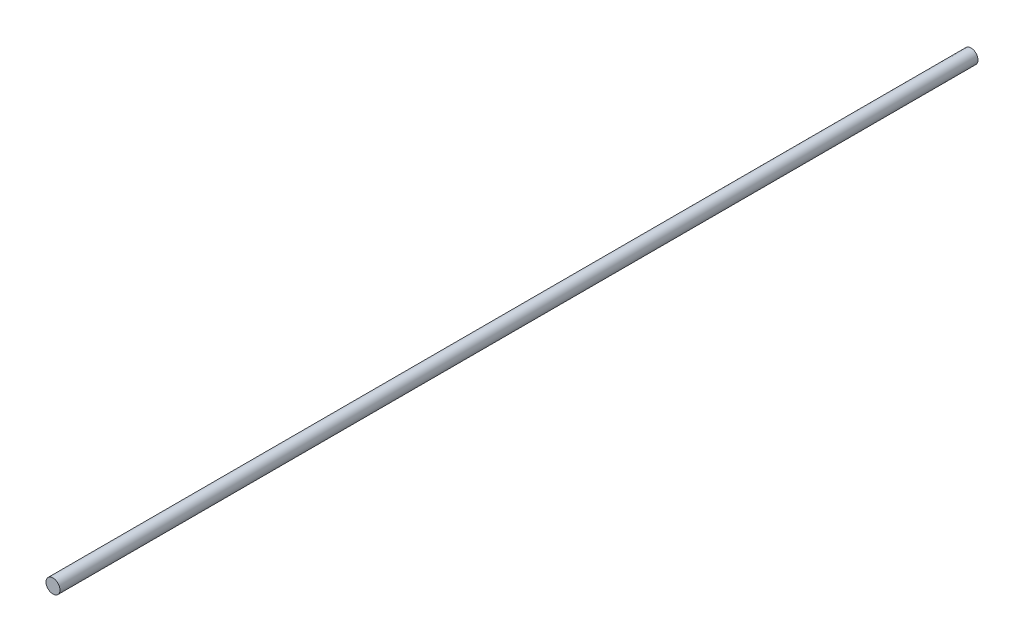
ISO-10303-21;
HEADER;
FILE_DESCRIPTION(('STEP AP214'),'2;1');
FILE_NAME('part.step','',(''),(''),'','','');
FILE_SCHEMA(('AUTOMOTIVE_DESIGN { 1 0 10303 214 1 1 1 1 }'));
ENDSEC;
DATA;
#1=APPLICATION_CONTEXT('core data for automotive mechanical design processes');
#2=APPLICATION_PROTOCOL_DEFINITION('international standard','automotive_design',2000,#1);
#3=PRODUCT_CONTEXT('',#1,'mechanical');
#4=PRODUCT('Part','Part','',(#3));
#5=PRODUCT_RELATED_PRODUCT_CATEGORY('part','',(#4));
#6=PRODUCT_DEFINITION_FORMATION('','',#4);
#7=PRODUCT_DEFINITION_CONTEXT('part definition',#1,'design');
#8=PRODUCT_DEFINITION('design','',#6,#7);
#9=PRODUCT_DEFINITION_SHAPE('','',#8);
#10=(LENGTH_UNIT() NAMED_UNIT(*) SI_UNIT(.MILLI.,.METRE.));
#11=(NAMED_UNIT(*) PLANE_ANGLE_UNIT() SI_UNIT($,.RADIAN.));
#12=(NAMED_UNIT(*) SI_UNIT($,.STERADIAN.) SOLID_ANGLE_UNIT());
#13=UNCERTAINTY_MEASURE_WITH_UNIT(LENGTH_MEASURE(1.E-05),#10,'distance_accuracy_value','');
#14=(GEOMETRIC_REPRESENTATION_CONTEXT(3) GLOBAL_UNCERTAINTY_ASSIGNED_CONTEXT((#13)) GLOBAL_UNIT_ASSIGNED_CONTEXT((#10,
#11,#12)) REPRESENTATION_CONTEXT('',''));
#15=CARTESIAN_POINT('',(0.,0.,0.));
#16=DIRECTION('',(0.,0.,1.));
#17=DIRECTION('',(1.,0.,0.));
#18=AXIS2_PLACEMENT_3D('',#15,#16,#17);
#19=CARTESIAN_POINT('',(0.,0.,98.5));
#20=DIRECTION('',(0.,0.,-1.));
#21=DIRECTION('',(-1.,0.,0.));
#22=AXIS2_PLACEMENT_3D('',#19,#20,#21);
#23=CYLINDRICAL_SURFACE('',#22,1.5);
#24=CARTESIAN_POINT('',(0.,0.,98.5));
#25=DIRECTION('',(0.,0.,1.));
#26=DIRECTION('',(1.,0.,0.));
#27=AXIS2_PLACEMENT_3D('',#24,#25,#26);
#28=CIRCLE('',#27,1.5);
#29=CARTESIAN_POINT('',(1.5,0.,98.5));
#30=VERTEX_POINT('',#29);
#31=EDGE_CURVE('E10',#30,#30,#28,.T.);
#32=ORIENTED_EDGE('',*,*,#31,.F.);
#33=EDGE_LOOP('',(#32));
#34=FACE_BOUND('',#33,.T.);
#35=CARTESIAN_POINT('',(0.,0.,-98.5));
#36=DIRECTION('',(0.,0.,1.));
#37=DIRECTION('',(1.,0.,0.));
#38=AXIS2_PLACEMENT_3D('',#35,#36,#37);
#39=CIRCLE('',#38,1.5);
#40=CARTESIAN_POINT('',(1.5,0.,-98.5));
#41=VERTEX_POINT('',#40);
#42=EDGE_CURVE('E42',#41,#41,#39,.T.);
#43=ORIENTED_EDGE('',*,*,#42,.T.);
#44=EDGE_LOOP('',(#43));
#45=FACE_BOUND('',#44,.T.);
#46=ADVANCED_FACE('F39',(#34,#45),#23,.T.);
#47=CARTESIAN_POINT('',(0.,0.,98.5));
#48=DIRECTION('',(0.,0.,1.));
#49=DIRECTION('',(1.,0.,0.));
#50=AXIS2_PLACEMENT_3D('',#47,#48,#49);
#51=PLANE('',#50);
#52=ORIENTED_EDGE('',*,*,#31,.T.);
#53=EDGE_LOOP('',(#52));
#54=FACE_BOUND('',#53,.T.);
#55=ADVANCED_FACE('F54',(#54),#51,.T.);
#56=CARTESIAN_POINT('',(0.,0.,-98.5));
#57=DIRECTION('',(0.,0.,1.));
#58=DIRECTION('',(1.,0.,0.));
#59=AXIS2_PLACEMENT_3D('',#56,#57,#58);
#60=PLANE('',#59);
#61=ORIENTED_EDGE('',*,*,#42,.F.);
#62=EDGE_LOOP('',(#61));
#63=FACE_BOUND('',#62,.T.);
#64=ADVANCED_FACE('F52',(#63),#60,.F.);
#65=CLOSED_SHELL('',(#46,#55,#64));
#66=MANIFOLD_SOLID_BREP('B2',#65);
#67=ADVANCED_BREP_SHAPE_REPRESENTATION('',(#18,#66),#14);
#68=SHAPE_DEFINITION_REPRESENTATION(#9,#67);
ENDSEC;
END-ISO-10303-21;
